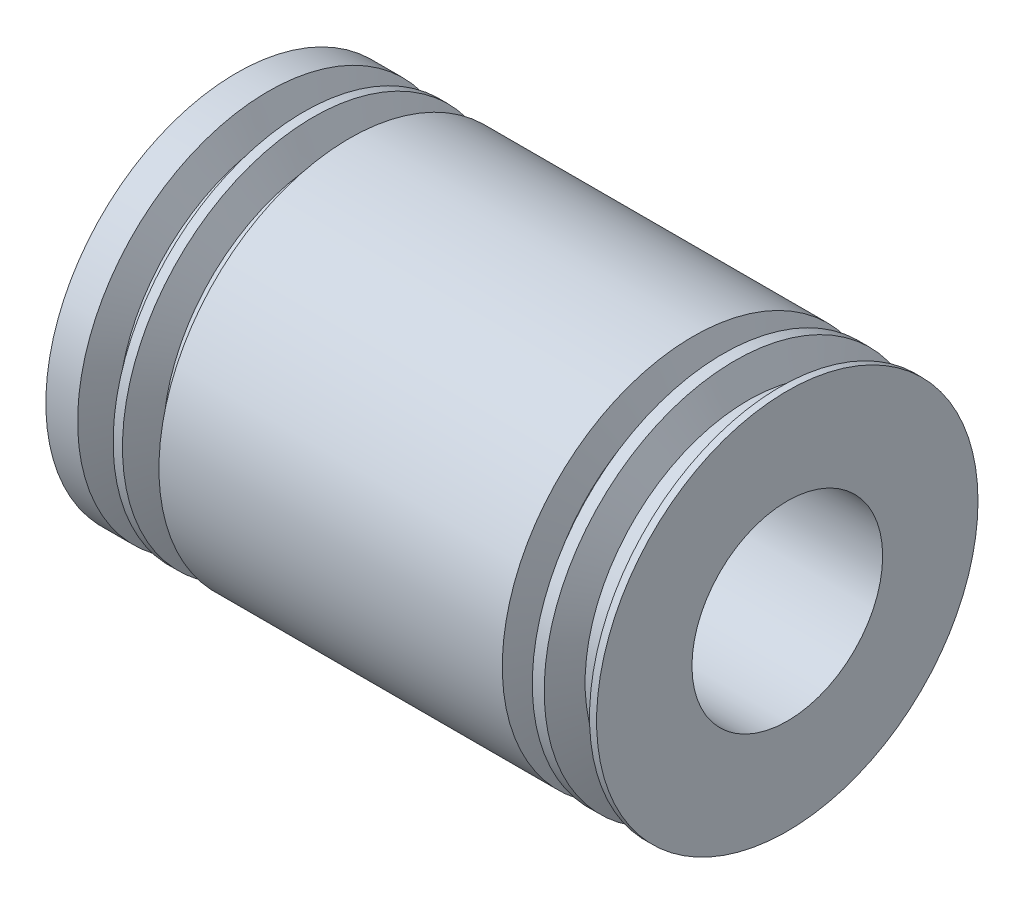
ISO-10303-21;
HEADER;
FILE_DESCRIPTION(('STEP AP214'),'2;1');
FILE_NAME('part.step','',(''),(''),'','','');
FILE_SCHEMA(('AUTOMOTIVE_DESIGN { 1 0 10303 214 1 1 1 1 }'));
ENDSEC;
DATA;
#1=APPLICATION_CONTEXT('core data for automotive mechanical design processes');
#2=APPLICATION_PROTOCOL_DEFINITION('international standard','automotive_design',2000,#1);
#3=PRODUCT_CONTEXT('',#1,'mechanical');
#4=PRODUCT('Part','Part','',(#3));
#5=PRODUCT_RELATED_PRODUCT_CATEGORY('part','',(#4));
#6=PRODUCT_DEFINITION_FORMATION('','',#4);
#7=PRODUCT_DEFINITION_CONTEXT('part definition',#1,'design');
#8=PRODUCT_DEFINITION('design','',#6,#7);
#9=PRODUCT_DEFINITION_SHAPE('','',#8);
#10=(LENGTH_UNIT() NAMED_UNIT(*) SI_UNIT(.MILLI.,.METRE.));
#11=(NAMED_UNIT(*) PLANE_ANGLE_UNIT() SI_UNIT($,.RADIAN.));
#12=(NAMED_UNIT(*) SI_UNIT($,.STERADIAN.) SOLID_ANGLE_UNIT());
#13=UNCERTAINTY_MEASURE_WITH_UNIT(LENGTH_MEASURE(1.E-05),#10,'distance_accuracy_value','');
#14=(GEOMETRIC_REPRESENTATION_CONTEXT(3) GLOBAL_UNCERTAINTY_ASSIGNED_CONTEXT((#13)) GLOBAL_UNIT_ASSIGNED_CONTEXT((#10,
#11,#12)) REPRESENTATION_CONTEXT('',''));
#15=CARTESIAN_POINT('',(0.,0.,0.));
#16=DIRECTION('',(0.,0.,1.));
#17=DIRECTION('',(1.,0.,0.));
#18=AXIS2_PLACEMENT_3D('',#15,#16,#17);
#19=CARTESIAN_POINT('',(-2.32473329131855,-3.,0.));
#20=DIRECTION('',(-1.,0.,0.));
#21=DIRECTION('',(0.,0.,1.));
#22=AXIS2_PLACEMENT_3D('',#19,#20,#21);
#23=CONICAL_SURFACE('',#22,5.13264515565663,1.22288391818355);
#24=CARTESIAN_POINT('',(-2.63929213576663,-3.,0.));
#25=DIRECTION('',(1.,0.,0.));
#26=DIRECTION('',(0.,0.,-1.));
#27=AXIS2_PLACEMENT_3D('',#24,#25,#26);
#28=CIRCLE('',#27,6.);
#29=CARTESIAN_POINT('',(-2.63929213576663,-3.,-6.));
#30=VERTEX_POINT('',#29);
#31=EDGE_CURVE('E10',#30,#30,#28,.T.);
#32=ORIENTED_EDGE('',*,*,#31,.T.);
#33=EDGE_LOOP('',(#32));
#34=FACE_BOUND('',#33,.T.);
#35=CARTESIAN_POINT('',(-2.32473329131855,-3.,0.));
#36=DIRECTION('',(1.,0.,0.));
#37=DIRECTION('',(0.,0.,-1.));
#38=AXIS2_PLACEMENT_3D('',#35,#36,#37);
#39=CIRCLE('',#38,5.13264515565663);
#40=CARTESIAN_POINT('',(-2.32473329131855,-3.,-5.13264515565663));
#41=VERTEX_POINT('',#40);
#42=EDGE_CURVE('E103',#41,#41,#39,.T.);
#43=ORIENTED_EDGE('',*,*,#42,.F.);
#44=EDGE_LOOP('',(#43));
#45=FACE_BOUND('',#44,.T.);
#46=ADVANCED_FACE('F39',(#34,#45),#23,.T.);
#47=CARTESIAN_POINT('',(0.327556569141859,-3.,0.));
#48=DIRECTION('',(1.,0.,0.));
#49=DIRECTION('',(0.,0.,-1.));
#50=AXIS2_PLACEMENT_3D('',#47,#48,#49);
#51=CYLINDRICAL_SURFACE('',#50,6.);
#52=CARTESIAN_POINT('',(-13.441762305189,-3.,0.));
#53=DIRECTION('',(1.,0.,0.));
#54=DIRECTION('',(0.,0.,-1.));
#55=AXIS2_PLACEMENT_3D('',#52,#53,#54);
#56=CIRCLE('',#55,6.);
#57=CARTESIAN_POINT('',(-13.441762305189,-3.,-6.));
#58=VERTEX_POINT('',#57);
#59=EDGE_CURVE('E45',#58,#58,#56,.T.);
#60=ORIENTED_EDGE('',*,*,#59,.T.);
#61=EDGE_LOOP('',(#60));
#62=FACE_BOUND('',#61,.T.);
#63=ORIENTED_EDGE('',*,*,#31,.F.);
#64=EDGE_LOOP('',(#63));
#65=FACE_BOUND('',#64,.T.);
#66=ADVANCED_FACE('F111',(#62,#65),#51,.T.);
#67=CARTESIAN_POINT('',(-13.907929964468,-3.,0.));
#68=DIRECTION('',(1.,0.,0.));
#69=DIRECTION('',(0.,0.,-1.));
#70=AXIS2_PLACEMENT_3D('',#67,#68,#69);
#71=CONICAL_SURFACE('',#70,5.13264515565663,1.07763248751491);
#72=ORIENTED_EDGE('',*,*,#59,.F.);
#73=EDGE_LOOP('',(#72));
#74=FACE_BOUND('',#73,.T.);
#75=CARTESIAN_POINT('',(-13.907929964468,-3.,0.));
#76=DIRECTION('',(1.,0.,0.));
#77=DIRECTION('',(0.,0.,-1.));
#78=AXIS2_PLACEMENT_3D('',#75,#76,#77);
#79=CIRCLE('',#78,5.13264515565663);
#80=CARTESIAN_POINT('',(-13.907929964468,-3.,-5.13264515565663));
#81=VERTEX_POINT('',#80);
#82=EDGE_CURVE('E49',#81,#81,#79,.T.);
#83=ORIENTED_EDGE('',*,*,#82,.T.);
#84=EDGE_LOOP('',(#83));
#85=FACE_BOUND('',#84,.T.);
#86=ADVANCED_FACE('F115',(#74,#85),#71,.T.);
#87=CARTESIAN_POINT('',(0.327556569141859,-3.,0.));
#88=DIRECTION('',(1.,0.,0.));
#89=DIRECTION('',(0.,0.,-1.));
#90=AXIS2_PLACEMENT_3D('',#87,#88,#89);
#91=CYLINDRICAL_SURFACE('',#90,5.13264515565663);
#92=ORIENTED_EDGE('',*,*,#82,.F.);
#93=EDGE_LOOP('',(#92));
#94=FACE_BOUND('',#93,.T.);
#95=CARTESIAN_POINT('',(-14.1764076298116,-3.,0.));
#96=DIRECTION('',(1.,0.,0.));
#97=DIRECTION('',(0.,0.,-1.));
#98=AXIS2_PLACEMENT_3D('',#95,#96,#97);
#99=CIRCLE('',#98,5.13264515565663);
#100=CARTESIAN_POINT('',(-14.1764076298116,-3.,-5.13264515565663));
#101=VERTEX_POINT('',#100);
#102=EDGE_CURVE('E53',#101,#101,#99,.T.);
#103=ORIENTED_EDGE('',*,*,#102,.T.);
#104=EDGE_LOOP('',(#103));
#105=FACE_BOUND('',#104,.T.);
#106=ADVANCED_FACE('F119',(#94,#105),#91,.T.);
#107=CARTESIAN_POINT('',(-14.5899936757905,-3.,0.));
#108=DIRECTION('',(-1.,0.,0.));
#109=DIRECTION('',(0.,0.,1.));
#110=AXIS2_PLACEMENT_3D('',#107,#108,#109);
#111=CONICAL_SURFACE('',#110,6.,1.12585101591865);
#112=ORIENTED_EDGE('',*,*,#102,.F.);
#113=EDGE_LOOP('',(#112));
#114=FACE_BOUND('',#113,.T.);
#115=CARTESIAN_POINT('',(-14.5899936757905,-3.,0.));
#116=DIRECTION('',(1.,0.,0.));
#117=DIRECTION('',(0.,0.,-1.));
#118=AXIS2_PLACEMENT_3D('',#115,#116,#117);
#119=CIRCLE('',#118,6.);
#120=CARTESIAN_POINT('',(-14.5899936757905,-3.,-6.));
#121=VERTEX_POINT('',#120);
#122=EDGE_CURVE('E58',#121,#121,#119,.T.);
#123=ORIENTED_EDGE('',*,*,#122,.T.);
#124=EDGE_LOOP('',(#123));
#125=FACE_BOUND('',#124,.T.);
#126=ADVANCED_FACE('F126',(#114,#125),#111,.T.);
#127=CARTESIAN_POINT('',(0.327556569141859,-3.,0.));
#128=DIRECTION('',(1.,0.,0.));
#129=DIRECTION('',(0.,0.,-1.));
#130=AXIS2_PLACEMENT_3D('',#127,#128,#129);
#131=CYLINDRICAL_SURFACE('',#130,6.);
#132=ORIENTED_EDGE('',*,*,#122,.F.);
#133=EDGE_LOOP('',(#132));
#134=FACE_BOUND('',#133,.T.);
#135=CARTESIAN_POINT('',(-14.8837173637605,-3.,0.));
#136=DIRECTION('',(1.,0.,0.));
#137=DIRECTION('',(0.,0.,-1.));
#138=AXIS2_PLACEMENT_3D('',#135,#136,#137);
#139=CIRCLE('',#138,6.);
#140=CARTESIAN_POINT('',(-14.8837173637605,-3.,-6.));
#141=VERTEX_POINT('',#140);
#142=EDGE_CURVE('E61',#141,#141,#139,.T.);
#143=ORIENTED_EDGE('',*,*,#142,.T.);
#144=EDGE_LOOP('',(#143));
#145=FACE_BOUND('',#144,.T.);
#146=ADVANCED_FACE('F130',(#134,#145),#131,.T.);
#147=CARTESIAN_POINT('',(-15.3637137754171,-3.,0.));
#148=DIRECTION('',(1.,0.,0.));
#149=DIRECTION('',(0.,0.,-1.));
#150=AXIS2_PLACEMENT_3D('',#147,#148,#149);
#151=CONICAL_SURFACE('',#150,5.13264515565663,1.06534452163463);
#152=ORIENTED_EDGE('',*,*,#142,.F.);
#153=EDGE_LOOP('',(#152));
#154=FACE_BOUND('',#153,.T.);
#155=CARTESIAN_POINT('',(-15.3637137754171,-3.,0.));
#156=DIRECTION('',(1.,0.,0.));
#157=DIRECTION('',(0.,0.,-1.));
#158=AXIS2_PLACEMENT_3D('',#155,#156,#157);
#159=CIRCLE('',#158,5.13264515565663);
#160=CARTESIAN_POINT('',(-15.3637137754171,-3.,-5.13264515565663));
#161=VERTEX_POINT('',#160);
#162=EDGE_CURVE('E64',#161,#161,#159,.T.);
#163=ORIENTED_EDGE('',*,*,#162,.T.);
#164=EDGE_LOOP('',(#163));
#165=FACE_BOUND('',#164,.T.);
#166=ADVANCED_FACE('F134',(#154,#165),#151,.T.);
#167=CARTESIAN_POINT('',(0.327556569141859,-3.,0.));
#168=DIRECTION('',(1.,0.,0.));
#169=DIRECTION('',(0.,0.,-1.));
#170=AXIS2_PLACEMENT_3D('',#167,#168,#169);
#171=CYLINDRICAL_SURFACE('',#170,5.13264515565663);
#172=ORIENTED_EDGE('',*,*,#162,.F.);
#173=EDGE_LOOP('',(#172));
#174=FACE_BOUND('',#173,.T.);
#175=CARTESIAN_POINT('',(-15.5864139540211,-3.,0.));
#176=DIRECTION('',(1.,0.,0.));
#177=DIRECTION('',(0.,0.,-1.));
#178=AXIS2_PLACEMENT_3D('',#175,#176,#177);
#179=CIRCLE('',#178,5.13264515565663);
#180=CARTESIAN_POINT('',(-15.5864139540211,-3.,-5.13264515565663));
#181=VERTEX_POINT('',#180);
#182=EDGE_CURVE('E67',#181,#181,#179,.T.);
#183=ORIENTED_EDGE('',*,*,#182,.T.);
#184=EDGE_LOOP('',(#183));
#185=FACE_BOUND('',#184,.T.);
#186=ADVANCED_FACE('F138',(#174,#185),#171,.T.);
#187=CARTESIAN_POINT('',(-16.,-3.,0.));
#188=DIRECTION('',(-1.,0.,0.));
#189=DIRECTION('',(0.,0.,1.));
#190=AXIS2_PLACEMENT_3D('',#187,#188,#189);
#191=CONICAL_SURFACE('',#190,6.,1.12585101591865);
#192=ORIENTED_EDGE('',*,*,#182,.F.);
#193=EDGE_LOOP('',(#192));
#194=FACE_BOUND('',#193,.T.);
#195=CARTESIAN_POINT('',(-16.,-3.,0.));
#196=DIRECTION('',(1.,0.,0.));
#197=DIRECTION('',(0.,0.,-1.));
#198=AXIS2_PLACEMENT_3D('',#195,#196,#197);
#199=CIRCLE('',#198,6.);
#200=CARTESIAN_POINT('',(-16.,-3.,-6.));
#201=VERTEX_POINT('',#200);
#202=EDGE_CURVE('E70',#201,#201,#199,.T.);
#203=ORIENTED_EDGE('',*,*,#202,.T.);
#204=EDGE_LOOP('',(#203));
#205=FACE_BOUND('',#204,.T.);
#206=ADVANCED_FACE('F142',(#194,#205),#191,.T.);
#207=CARTESIAN_POINT('',(0.327556569141859,-3.,0.));
#208=DIRECTION('',(1.,0.,0.));
#209=DIRECTION('',(0.,0.,-1.));
#210=AXIS2_PLACEMENT_3D('',#207,#208,#209);
#211=CYLINDRICAL_SURFACE('',#210,6.);
#212=ORIENTED_EDGE('',*,*,#202,.F.);
#213=EDGE_LOOP('',(#212));
#214=FACE_BOUND('',#213,.T.);
#215=CARTESIAN_POINT('',(-17.,-3.,0.));
#216=DIRECTION('',(1.,0.,0.));
#217=DIRECTION('',(0.,0.,-1.));
#218=AXIS2_PLACEMENT_3D('',#215,#216,#217);
#219=CIRCLE('',#218,6.);
#220=CARTESIAN_POINT('',(-17.,-3.,-6.));
#221=VERTEX_POINT('',#220);
#222=EDGE_CURVE('E73',#221,#221,#219,.T.);
#223=ORIENTED_EDGE('',*,*,#222,.T.);
#224=EDGE_LOOP('',(#223));
#225=FACE_BOUND('',#224,.T.);
#226=ADVANCED_FACE('F146',(#214,#225),#211,.T.);
#227=CARTESIAN_POINT('',(-17.,0.,0.));
#228=DIRECTION('',(1.,0.,0.));
#229=DIRECTION('',(0.,0.,-1.));
#230=AXIS2_PLACEMENT_3D('',#227,#228,#229);
#231=PLANE('',#230);
#232=ORIENTED_EDGE('',*,*,#222,.F.);
#233=EDGE_LOOP('',(#232));
#234=FACE_BOUND('',#233,.T.);
#235=CARTESIAN_POINT('',(-17.,-3.,0.));
#236=DIRECTION('',(1.,0.,0.));
#237=DIRECTION('',(0.,0.,-1.));
#238=AXIS2_PLACEMENT_3D('',#235,#236,#237);
#239=CIRCLE('',#238,3.);
#240=CARTESIAN_POINT('',(-17.,-3.,-3.));
#241=VERTEX_POINT('',#240);
#242=EDGE_CURVE('E76',#241,#241,#239,.T.);
#243=ORIENTED_EDGE('',*,*,#242,.T.);
#244=EDGE_LOOP('',(#243));
#245=FACE_BOUND('',#244,.T.);
#246=ADVANCED_FACE('F150',(#234,#245),#231,.F.);
#247=CARTESIAN_POINT('',(0.327556569141859,-3.,0.));
#248=DIRECTION('',(1.,0.,0.));
#249=DIRECTION('',(0.,0.,-1.));
#250=AXIS2_PLACEMENT_3D('',#247,#248,#249);
#251=CYLINDRICAL_SURFACE('',#250,3.);
#252=ORIENTED_EDGE('',*,*,#242,.F.);
#253=EDGE_LOOP('',(#252));
#254=FACE_BOUND('',#253,.T.);
#255=CARTESIAN_POINT('',(0.327556569141859,-3.,0.));
#256=DIRECTION('',(1.,0.,0.));
#257=DIRECTION('',(0.,0.,-1.));
#258=AXIS2_PLACEMENT_3D('',#255,#256,#257);
#259=CIRCLE('',#258,3.);
#260=CARTESIAN_POINT('',(0.327556569141859,-3.,-3.));
#261=VERTEX_POINT('',#260);
#262=EDGE_CURVE('E79',#261,#261,#259,.T.);
#263=ORIENTED_EDGE('',*,*,#262,.T.);
#264=EDGE_LOOP('',(#263));
#265=FACE_BOUND('',#264,.T.);
#266=ADVANCED_FACE('F154',(#254,#265),#251,.F.);
#267=CARTESIAN_POINT('',(0.327556569141858,0.,0.));
#268=DIRECTION('',(-1.,0.,0.));
#269=DIRECTION('',(0.,0.,1.));
#270=AXIS2_PLACEMENT_3D('',#267,#268,#269);
#271=PLANE('',#270);
#272=ORIENTED_EDGE('',*,*,#262,.F.);
#273=EDGE_LOOP('',(#272));
#274=FACE_BOUND('',#273,.T.);
#275=CARTESIAN_POINT('',(0.327556569141858,-3.,0.));
#276=DIRECTION('',(1.,0.,0.));
#277=DIRECTION('',(0.,0.,-1.));
#278=AXIS2_PLACEMENT_3D('',#275,#276,#277);
#279=CIRCLE('',#278,6.);
#280=CARTESIAN_POINT('',(0.327556569141858,-3.,-6.));
#281=VERTEX_POINT('',#280);
#282=EDGE_CURVE('E82',#281,#281,#279,.T.);
#283=ORIENTED_EDGE('',*,*,#282,.T.);
#284=EDGE_LOOP('',(#283));
#285=FACE_BOUND('',#284,.T.);
#286=ADVANCED_FACE('F158',(#274,#285),#271,.F.);
#287=CARTESIAN_POINT('',(0.327556569141859,-3.,0.));
#288=DIRECTION('',(1.,0.,0.));
#289=DIRECTION('',(0.,0.,-1.));
#290=AXIS2_PLACEMENT_3D('',#287,#288,#289);
#291=CYLINDRICAL_SURFACE('',#290,6.);
#292=ORIENTED_EDGE('',*,*,#282,.F.);
#293=EDGE_LOOP('',(#292));
#294=FACE_BOUND('',#293,.T.);
#295=CARTESIAN_POINT('',(0.104856390537824,-3.,0.));
#296=DIRECTION('',(1.,0.,0.));
#297=DIRECTION('',(0.,0.,-1.));
#298=AXIS2_PLACEMENT_3D('',#295,#296,#297);
#299=CIRCLE('',#298,6.);
#300=CARTESIAN_POINT('',(0.104856390537824,-3.,-6.));
#301=VERTEX_POINT('',#300);
#302=EDGE_CURVE('E85',#301,#301,#299,.T.);
#303=ORIENTED_EDGE('',*,*,#302,.T.);
#304=EDGE_LOOP('',(#303));
#305=FACE_BOUND('',#304,.T.);
#306=ADVANCED_FACE('F162',(#294,#305),#291,.T.);
#307=CARTESIAN_POINT('',(-0.37514002111868,-3.,0.));
#308=DIRECTION('',(1.,0.,0.));
#309=DIRECTION('',(0.,0.,-1.));
#310=AXIS2_PLACEMENT_3D('',#307,#308,#309);
#311=CONICAL_SURFACE('',#310,5.13264515565663,1.06534452163463);
#312=ORIENTED_EDGE('',*,*,#302,.F.);
#313=EDGE_LOOP('',(#312));
#314=FACE_BOUND('',#313,.T.);
#315=CARTESIAN_POINT('',(-0.37514002111868,-3.,0.));
#316=DIRECTION('',(1.,0.,0.));
#317=DIRECTION('',(0.,0.,-1.));
#318=AXIS2_PLACEMENT_3D('',#315,#316,#317);
#319=CIRCLE('',#318,5.13264515565663);
#320=CARTESIAN_POINT('',(-0.37514002111868,-3.,-5.13264515565663));
#321=VERTEX_POINT('',#320);
#322=EDGE_CURVE('E88',#321,#321,#319,.T.);
#323=ORIENTED_EDGE('',*,*,#322,.T.);
#324=EDGE_LOOP('',(#323));
#325=FACE_BOUND('',#324,.T.);
#326=ADVANCED_FACE('F166',(#314,#325),#311,.T.);
#327=CARTESIAN_POINT('',(0.327556569141859,-3.,0.));
#328=DIRECTION('',(1.,0.,0.));
#329=DIRECTION('',(0.,0.,-1.));
#330=AXIS2_PLACEMENT_3D('',#327,#328,#329);
#331=CYLINDRICAL_SURFACE('',#330,5.13264515565663);
#332=CARTESIAN_POINT('',(-0.901728995005832,-3.,0.));
#333=DIRECTION('',(1.,0.,0.));
#334=DIRECTION('',(0.,0.,-1.));
#335=AXIS2_PLACEMENT_3D('',#332,#333,#334);
#336=CIRCLE('',#335,5.13264515565663);
#337=CARTESIAN_POINT('',(-0.901728995005832,-3.,-5.13264515565663));
#338=VERTEX_POINT('',#337);
#339=EDGE_CURVE('E91',#338,#338,#336,.T.);
#340=ORIENTED_EDGE('',*,*,#339,.T.);
#341=EDGE_LOOP('',(#340));
#342=FACE_BOUND('',#341,.T.);
#343=ORIENTED_EDGE('',*,*,#322,.F.);
#344=EDGE_LOOP('',(#343));
#345=FACE_BOUND('',#344,.T.);
#346=ADVANCED_FACE('F170',(#342,#345),#331,.T.);
#347=CARTESIAN_POINT('',(-0.901728995005832,-3.,0.));
#348=DIRECTION('',(-1.,0.,0.));
#349=DIRECTION('',(0.,0.,1.));
#350=AXIS2_PLACEMENT_3D('',#347,#348,#349);
#351=CONICAL_SURFACE('',#350,5.13264515565663,1.12039290628028);
#352=CARTESIAN_POINT('',(-1.32114078760327,-3.,0.));
#353=DIRECTION('',(1.,0.,0.));
#354=DIRECTION('',(0.,0.,-1.));
#355=AXIS2_PLACEMENT_3D('',#352,#353,#354);
#356=CIRCLE('',#355,6.);
#357=CARTESIAN_POINT('',(-1.32114078760327,-3.,-6.));
#358=VERTEX_POINT('',#357);
#359=EDGE_CURVE('E94',#358,#358,#356,.T.);
#360=ORIENTED_EDGE('',*,*,#359,.T.);
#361=EDGE_LOOP('',(#360));
#362=FACE_BOUND('',#361,.T.);
#363=ORIENTED_EDGE('',*,*,#339,.F.);
#364=EDGE_LOOP('',(#363));
#365=FACE_BOUND('',#364,.T.);
#366=ADVANCED_FACE('F174',(#362,#365),#351,.T.);
#367=CARTESIAN_POINT('',(0.327556569141859,-3.,0.));
#368=DIRECTION('',(1.,0.,0.));
#369=DIRECTION('',(0.,0.,-1.));
#370=AXIS2_PLACEMENT_3D('',#367,#368,#369);
#371=CYLINDRICAL_SURFACE('',#370,6.);
#372=CARTESIAN_POINT('',(-1.6956156024224,-3.,0.));
#373=DIRECTION('',(1.,0.,0.));
#374=DIRECTION('',(0.,0.,-1.));
#375=AXIS2_PLACEMENT_3D('',#372,#373,#374);
#376=CIRCLE('',#375,6.);
#377=CARTESIAN_POINT('',(-1.6956156024224,-3.,-6.));
#378=VERTEX_POINT('',#377);
#379=EDGE_CURVE('E97',#378,#378,#376,.T.);
#380=ORIENTED_EDGE('',*,*,#379,.T.);
#381=EDGE_LOOP('',(#380));
#382=FACE_BOUND('',#381,.T.);
#383=ORIENTED_EDGE('',*,*,#359,.F.);
#384=EDGE_LOOP('',(#383));
#385=FACE_BOUND('',#384,.T.);
#386=ADVANCED_FACE('F178',(#382,#385),#371,.T.);
#387=CARTESIAN_POINT('',(-1.6956156024224,-3.,0.));
#388=DIRECTION('',(1.,0.,0.));
#389=DIRECTION('',(0.,0.,-1.));
#390=AXIS2_PLACEMENT_3D('',#387,#388,#389);
#391=CONICAL_SURFACE('',#390,6.,1.22480387901812);
#392=CARTESIAN_POINT('',(-2.00829144050511,-3.,0.));
#393=DIRECTION('',(1.,0.,0.));
#394=DIRECTION('',(0.,0.,-1.));
#395=AXIS2_PLACEMENT_3D('',#392,#393,#394);
#396=CIRCLE('',#395,5.13264515565663);
#397=CARTESIAN_POINT('',(-2.00829144050511,-3.,-5.13264515565663));
#398=VERTEX_POINT('',#397);
#399=EDGE_CURVE('E100',#398,#398,#396,.T.);
#400=ORIENTED_EDGE('',*,*,#399,.T.);
#401=EDGE_LOOP('',(#400));
#402=FACE_BOUND('',#401,.T.);
#403=ORIENTED_EDGE('',*,*,#379,.F.);
#404=EDGE_LOOP('',(#403));
#405=FACE_BOUND('',#404,.T.);
#406=ADVANCED_FACE('F182',(#402,#405),#391,.T.);
#407=CARTESIAN_POINT('',(0.327556569141859,-3.,0.));
#408=DIRECTION('',(1.,0.,0.));
#409=DIRECTION('',(0.,0.,-1.));
#410=AXIS2_PLACEMENT_3D('',#407,#408,#409);
#411=CYLINDRICAL_SURFACE('',#410,5.13264515565663);
#412=ORIENTED_EDGE('',*,*,#42,.T.);
#413=EDGE_LOOP('',(#412));
#414=FACE_BOUND('',#413,.T.);
#415=ORIENTED_EDGE('',*,*,#399,.F.);
#416=EDGE_LOOP('',(#415));
#417=FACE_BOUND('',#416,.T.);
#418=ADVANCED_FACE('F107',(#414,#417),#411,.T.);
#419=CLOSED_SHELL('',(#46,#66,#86,#106,#126,#146,#166,#186,#206,#226,#246,#266,#286,#306,#326,
#346,#366,#386,#406,#418));
#420=MANIFOLD_SOLID_BREP('B2',#419);
#421=ADVANCED_BREP_SHAPE_REPRESENTATION('',(#18,#420),#14);
#422=SHAPE_DEFINITION_REPRESENTATION(#9,#421);
ENDSEC;
END-ISO-10303-21;
